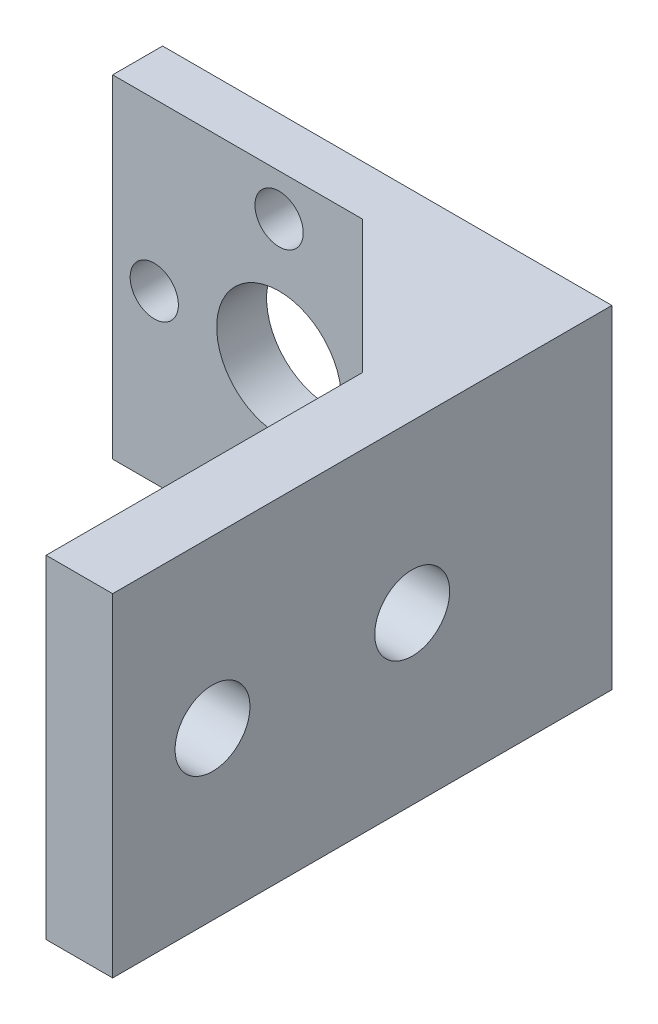
ISO-10303-21;
HEADER;
FILE_DESCRIPTION(('STEP AP214'),'2;1');
FILE_NAME('part.step','',(''),(''),'','','');
FILE_SCHEMA(('AUTOMOTIVE_DESIGN { 1 0 10303 214 1 1 1 1 }'));
ENDSEC;
DATA;
#1=APPLICATION_CONTEXT('core data for automotive mechanical design processes');
#2=APPLICATION_PROTOCOL_DEFINITION('international standard','automotive_design',2000,#1);
#3=PRODUCT_CONTEXT('',#1,'mechanical');
#4=PRODUCT('Part','Part','',(#3));
#5=PRODUCT_RELATED_PRODUCT_CATEGORY('part','',(#4));
#6=PRODUCT_DEFINITION_FORMATION('','',#4);
#7=PRODUCT_DEFINITION_CONTEXT('part definition',#1,'design');
#8=PRODUCT_DEFINITION('design','',#6,#7);
#9=PRODUCT_DEFINITION_SHAPE('','',#8);
#10=(LENGTH_UNIT() NAMED_UNIT(*) SI_UNIT(.MILLI.,.METRE.));
#11=(NAMED_UNIT(*) PLANE_ANGLE_UNIT() SI_UNIT($,.RADIAN.));
#12=(NAMED_UNIT(*) SI_UNIT($,.STERADIAN.) SOLID_ANGLE_UNIT());
#13=UNCERTAINTY_MEASURE_WITH_UNIT(LENGTH_MEASURE(1.E-05),#10,'distance_accuracy_value','');
#14=(GEOMETRIC_REPRESENTATION_CONTEXT(3) GLOBAL_UNCERTAINTY_ASSIGNED_CONTEXT((#13)) GLOBAL_UNIT_ASSIGNED_CONTEXT((#10,
#11,#12)) REPRESENTATION_CONTEXT('',''));
#15=CARTESIAN_POINT('',(0.,0.,0.));
#16=DIRECTION('',(0.,0.,1.));
#17=DIRECTION('',(1.,0.,0.));
#18=AXIS2_PLACEMENT_3D('',#15,#16,#17);
#19=CARTESIAN_POINT('',(17.,10.,30.));
#20=DIRECTION('',(1.,0.,0.));
#21=DIRECTION('',(0.,1.,0.));
#22=AXIS2_PLACEMENT_3D('',#19,#20,#21);
#23=PLANE('',#22);
#24=DIRECTION('',(0.,-1.,0.));
#25=VECTOR('',#24,1.);
#26=CARTESIAN_POINT('',(17.,10.,0.));
#27=LINE('',#26,#25);
#28=CARTESIAN_POINT('',(17.,10.,0.));
#29=VERTEX_POINT('',#28);
#30=CARTESIAN_POINT('',(17.,-10.,0.));
#31=VERTEX_POINT('',#30);
#32=EDGE_CURVE('E261',#29,#31,#27,.T.);
#33=ORIENTED_EDGE('',*,*,#32,.F.);
#34=DIRECTION('',(0.,0.,-1.));
#35=VECTOR('',#34,1.);
#36=CARTESIAN_POINT('',(17.,10.,30.));
#37=LINE('',#36,#35);
#38=CARTESIAN_POINT('',(17.,10.,30.));
#39=VERTEX_POINT('',#38);
#40=EDGE_CURVE('E224',#39,#29,#37,.T.);
#41=ORIENTED_EDGE('',*,*,#40,.F.);
#42=DIRECTION('',(0.,-1.,0.));
#43=VECTOR('',#42,1.);
#44=CARTESIAN_POINT('',(17.,10.,30.));
#45=LINE('',#44,#43);
#46=CARTESIAN_POINT('',(17.,-10.,30.));
#47=VERTEX_POINT('',#46);
#48=EDGE_CURVE('E267',#39,#47,#45,.T.);
#49=ORIENTED_EDGE('',*,*,#48,.T.);
#50=DIRECTION('',(0.,0.,-1.));
#51=VECTOR('',#50,1.);
#52=CARTESIAN_POINT('',(17.,-10.,30.));
#53=LINE('',#52,#51);
#54=EDGE_CURVE('E256',#47,#31,#53,.T.);
#55=ORIENTED_EDGE('',*,*,#54,.T.);
#56=EDGE_LOOP('',(#33,#41,#49,#55));
#57=FACE_BOUND('',#56,.T.);
#58=CARTESIAN_POINT('',(17.,0.,24.));
#59=DIRECTION('',(-1.,0.,0.));
#60=DIRECTION('',(0.,0.,1.));
#61=AXIS2_PLACEMENT_3D('',#58,#59,#60);
#62=CIRCLE('',#61,2.25);
#63=CARTESIAN_POINT('',(17.,0.,26.25));
#64=VERTEX_POINT('',#63);
#65=EDGE_CURVE('E275',#64,#64,#62,.T.);
#66=ORIENTED_EDGE('',*,*,#65,.T.);
#67=EDGE_LOOP('',(#66));
#68=FACE_BOUND('',#67,.T.);
#69=CARTESIAN_POINT('',(17.,0.,12.));
#70=DIRECTION('',(-1.,0.,0.));
#71=DIRECTION('',(0.,0.,1.));
#72=AXIS2_PLACEMENT_3D('',#69,#70,#71);
#73=CIRCLE('',#72,2.25);
#74=CARTESIAN_POINT('',(17.,0.,14.25));
#75=VERTEX_POINT('',#74);
#76=EDGE_CURVE('E117',#75,#75,#73,.T.);
#77=ORIENTED_EDGE('',*,*,#76,.T.);
#78=EDGE_LOOP('',(#77));
#79=FACE_BOUND('',#78,.T.);
#80=ADVANCED_FACE('F32',(#57,#68,#79),#23,.T.);
#81=CARTESIAN_POINT('',(13.,10.,11.0000000000001));
#82=DIRECTION('',(0.707106781186544,0.,-0.707106781186551));
#83=DIRECTION('',(0.,-1.,0.));
#84=AXIS2_PLACEMENT_3D('',#81,#82,#83);
#85=PLANE('',#84);
#86=CARTESIAN_POINT('',(0.,0.,-1.99999999999981));
#87=DIRECTION('',(0.707106781186544,0.,-0.707106781186551));
#88=DIRECTION('',(0.707106781186551,0.,0.707106781186544));
#89=AXIS2_PLACEMENT_3D('',#86,#87,#88);
#90=ELLIPSE('',#89,14.8492424049174,10.5);
#91=CARTESIAN_POINT('',(4.99999999999986,9.23309265630977,3.));
#92=VERTEX_POINT('',#91);
#93=CARTESIAN_POINT('',(10.3660714285714,1.67169469035333,8.36607142857149));
#94=VERTEX_POINT('',#93);
#95=EDGE_CURVE('E127',#92,#94,#90,.T.);
#96=ORIENTED_EDGE('',*,*,#95,.T.);
#97=CARTESIAN_POINT('',(14.,0.,12.));
#98=DIRECTION('',(0.707106781186544,0.,-0.707106781186551));
#99=DIRECTION('',(-0.707106781186551,0.,-0.707106781186544));
#100=AXIS2_PLACEMENT_3D('',#97,#98,#99);
#101=ELLIPSE('',#100,5.6568542494924,4.);
#102=CARTESIAN_POINT('',(13.,3.87298334620743,11.0000000000001));
#103=VERTEX_POINT('',#102);
#104=EDGE_CURVE('E49',#94,#103,#101,.T.);
#105=ORIENTED_EDGE('',*,*,#104,.T.);
#106=DIRECTION('',(0.,-1.,0.));
#107=VECTOR('',#106,1.);
#108=CARTESIAN_POINT('',(13.,10.,11.0000000000001));
#109=LINE('',#108,#107);
#110=CARTESIAN_POINT('',(13.,10.,11.0000000000001));
#111=VERTEX_POINT('',#110);
#112=EDGE_CURVE('E125',#111,#103,#109,.T.);
#113=ORIENTED_EDGE('',*,*,#112,.F.);
#114=DIRECTION('',(0.707106781186551,0.,0.707106781186544));
#115=VECTOR('',#114,1.);
#116=CARTESIAN_POINT('',(-2.50000000000014,10.,-4.49999999999993));
#117=LINE('',#116,#115);
#118=CARTESIAN_POINT('',(4.99999999999986,10.,3.));
#119=VERTEX_POINT('',#118);
#120=EDGE_CURVE('E148',#119,#111,#117,.T.);
#121=ORIENTED_EDGE('',*,*,#120,.F.);
#122=DIRECTION('',(0.,1.,0.));
#123=VECTOR('',#122,1.);
#124=CARTESIAN_POINT('',(4.99999999999986,0.,3.));
#125=LINE('',#124,#123);
#126=EDGE_CURVE('E135',#92,#119,#125,.T.);
#127=ORIENTED_EDGE('',*,*,#126,.F.);
#128=EDGE_LOOP('',(#96,#105,#113,#121,#127));
#129=FACE_BOUND('',#128,.T.);
#130=ADVANCED_FACE('F123',(#129),#85,.F.);
#131=CARTESIAN_POINT('',(-9.99999999999999,10.,3.));
#132=DIRECTION('',(0.,-1.,0.));
#133=DIRECTION('',(0.,0.,-1.));
#134=AXIS2_PLACEMENT_3D('',#131,#132,#133);
#135=PLANE('',#134);
#136=DIRECTION('',(-1.,0.,0.));
#137=VECTOR('',#136,1.);
#138=CARTESIAN_POINT('',(-9.99999999999999,10.,0.));
#139=LINE('',#138,#137);
#140=CARTESIAN_POINT('',(-9.99999999999999,10.,0.));
#141=VERTEX_POINT('',#140);
#142=EDGE_CURVE('E219',#29,#141,#139,.T.);
#143=ORIENTED_EDGE('',*,*,#142,.T.);
#144=DIRECTION('',(0.,0.,-1.));
#145=VECTOR('',#144,1.);
#146=CARTESIAN_POINT('',(-9.99999999999999,10.,3.));
#147=LINE('',#146,#145);
#148=CARTESIAN_POINT('',(-9.99999999999999,10.,3.));
#149=VERTEX_POINT('',#148);
#150=EDGE_CURVE('E140',#149,#141,#147,.T.);
#151=ORIENTED_EDGE('',*,*,#150,.F.);
#152=DIRECTION('',(-1.,0.,0.));
#153=VECTOR('',#152,1.);
#154=CARTESIAN_POINT('',(-9.99999999999999,10.,3.));
#155=LINE('',#154,#153);
#156=EDGE_CURVE('E238',#119,#149,#155,.T.);
#157=ORIENTED_EDGE('',*,*,#156,.F.);
#158=ORIENTED_EDGE('',*,*,#120,.T.);
#159=DIRECTION('',(0.,0.,-1.));
#160=VECTOR('',#159,1.);
#161=CARTESIAN_POINT('',(13.,10.,30.));
#162=LINE('',#161,#160);
#163=CARTESIAN_POINT('',(13.,10.,30.));
#164=VERTEX_POINT('',#163);
#165=EDGE_CURVE('E134',#164,#111,#162,.T.);
#166=ORIENTED_EDGE('',*,*,#165,.F.);
#167=DIRECTION('',(1.,0.,0.));
#168=VECTOR('',#167,1.);
#169=CARTESIAN_POINT('',(13.,10.,30.));
#170=LINE('',#169,#168);
#171=EDGE_CURVE('E270',#164,#39,#170,.T.);
#172=ORIENTED_EDGE('',*,*,#171,.T.);
#173=ORIENTED_EDGE('',*,*,#40,.T.);
#174=EDGE_LOOP('',(#143,#151,#157,#158,#166,#172,#173));
#175=FACE_BOUND('',#174,.T.);
#176=ADVANCED_FACE('F186',(#175),#135,.F.);
#177=CARTESIAN_POINT('',(-9.99999999999999,-10.,3.));
#178=DIRECTION('',(1.,0.,0.));
#179=DIRECTION('',(0.,0.,-1.));
#180=AXIS2_PLACEMENT_3D('',#177,#178,#179);
#181=PLANE('',#180);
#182=DIRECTION('',(0.,-1.,0.));
#183=VECTOR('',#182,1.);
#184=CARTESIAN_POINT('',(-9.99999999999999,-10.,0.));
#185=LINE('',#184,#183);
#186=CARTESIAN_POINT('',(-9.99999999999999,-10.,0.));
#187=VERTEX_POINT('',#186);
#188=EDGE_CURVE('E228',#141,#187,#185,.T.);
#189=ORIENTED_EDGE('',*,*,#188,.T.);
#190=DIRECTION('',(0.,0.,-1.));
#191=VECTOR('',#190,1.);
#192=CARTESIAN_POINT('',(-9.99999999999999,-10.,3.));
#193=LINE('',#192,#191);
#194=CARTESIAN_POINT('',(-9.99999999999999,-10.,3.));
#195=VERTEX_POINT('',#194);
#196=EDGE_CURVE('E234',#195,#187,#193,.T.);
#197=ORIENTED_EDGE('',*,*,#196,.F.);
#198=DIRECTION('',(0.,-1.,0.));
#199=VECTOR('',#198,1.);
#200=CARTESIAN_POINT('',(-9.99999999999999,-10.,3.));
#201=LINE('',#200,#199);
#202=EDGE_CURVE('E233',#149,#195,#201,.T.);
#203=ORIENTED_EDGE('',*,*,#202,.F.);
#204=ORIENTED_EDGE('',*,*,#150,.T.);
#205=EDGE_LOOP('',(#189,#197,#203,#204));
#206=FACE_BOUND('',#205,.T.);
#207=ADVANCED_FACE('F209',(#206),#181,.F.);
#208=CARTESIAN_POINT('',(-9.99999999999999,-10.,3.));
#209=DIRECTION('',(0.,1.,0.));
#210=DIRECTION('',(0.,0.,1.));
#211=AXIS2_PLACEMENT_3D('',#208,#209,#210);
#212=PLANE('',#211);
#213=DIRECTION('',(1.,0.,0.));
#214=VECTOR('',#213,1.);
#215=CARTESIAN_POINT('',(-9.99999999999999,-10.,0.));
#216=LINE('',#215,#214);
#217=EDGE_CURVE('E236',#187,#31,#216,.T.);
#218=ORIENTED_EDGE('',*,*,#217,.T.);
#219=ORIENTED_EDGE('',*,*,#54,.F.);
#220=DIRECTION('',(-1.,0.,0.));
#221=VECTOR('',#220,1.);
#222=CARTESIAN_POINT('',(13.,-10.,30.));
#223=LINE('',#222,#221);
#224=CARTESIAN_POINT('',(13.,-10.,30.));
#225=VERTEX_POINT('',#224);
#226=EDGE_CURVE('E254',#47,#225,#223,.T.);
#227=ORIENTED_EDGE('',*,*,#226,.T.);
#228=DIRECTION('',(0.,0.,-1.));
#229=VECTOR('',#228,1.);
#230=CARTESIAN_POINT('',(13.,-10.,30.));
#231=LINE('',#230,#229);
#232=CARTESIAN_POINT('',(13.,-10.,11.0000000000001));
#233=VERTEX_POINT('',#232);
#234=EDGE_CURVE('E250',#225,#233,#231,.T.);
#235=ORIENTED_EDGE('',*,*,#234,.T.);
#236=DIRECTION('',(-0.707106781186551,0.,-0.707106781186544));
#237=VECTOR('',#236,1.);
#238=CARTESIAN_POINT('',(-2.50000000000014,-10.,-4.49999999999993));
#239=LINE('',#238,#237);
#240=CARTESIAN_POINT('',(4.99999999999986,-10.,3.));
#241=VERTEX_POINT('',#240);
#242=EDGE_CURVE('E145',#233,#241,#239,.T.);
#243=ORIENTED_EDGE('',*,*,#242,.T.);
#244=DIRECTION('',(1.,0.,0.));
#245=VECTOR('',#244,1.);
#246=CARTESIAN_POINT('',(-9.99999999999999,-10.,3.));
#247=LINE('',#246,#245);
#248=EDGE_CURVE('E241',#195,#241,#247,.T.);
#249=ORIENTED_EDGE('',*,*,#248,.F.);
#250=ORIENTED_EDGE('',*,*,#196,.T.);
#251=EDGE_LOOP('',(#218,#219,#227,#235,#243,#249,#250));
#252=FACE_BOUND('',#251,.T.);
#253=ADVANCED_FACE('F202',(#252),#212,.F.);
#254=CARTESIAN_POINT('',(0.,0.,3.));
#255=DIRECTION('',(0.,0.,-1.));
#256=DIRECTION('',(-1.,0.,0.));
#257=AXIS2_PLACEMENT_3D('',#254,#255,#256);
#258=PLANE('',#257);
#259=CARTESIAN_POINT('',(0.,7.5,3.));
#260=DIRECTION('',(0.,0.,-1.));
#261=DIRECTION('',(-1.,0.,0.));
#262=AXIS2_PLACEMENT_3D('',#259,#260,#261);
#263=CIRCLE('',#262,1.45);
#264=CARTESIAN_POINT('',(-1.45,7.5,3.));
#265=VERTEX_POINT('',#264);
#266=EDGE_CURVE('E36',#265,#265,#263,.T.);
#267=ORIENTED_EDGE('',*,*,#266,.T.);
#268=EDGE_LOOP('',(#267));
#269=FACE_BOUND('',#268,.T.);
#270=CARTESIAN_POINT('',(7.5,0.,3.));
#271=DIRECTION('',(0.,0.,-1.));
#272=DIRECTION('',(-1.,0.,0.));
#273=AXIS2_PLACEMENT_3D('',#270,#271,#272);
#274=CIRCLE('',#273,1.45);
#275=CARTESIAN_POINT('',(6.05,0.,3.));
#276=VERTEX_POINT('',#275);
#277=EDGE_CURVE('E291',#276,#276,#274,.T.);
#278=ORIENTED_EDGE('',*,*,#277,.T.);
#279=EDGE_LOOP('',(#278));
#280=FACE_BOUND('',#279,.T.);
#281=CARTESIAN_POINT('',(-7.5,0.,3.));
#282=DIRECTION('',(0.,0.,-1.));
#283=DIRECTION('',(-1.,0.,0.));
#284=AXIS2_PLACEMENT_3D('',#281,#282,#283);
#285=CIRCLE('',#284,1.45);
#286=CARTESIAN_POINT('',(-8.95,0.,3.));
#287=VERTEX_POINT('',#286);
#288=EDGE_CURVE('E285',#287,#287,#285,.T.);
#289=ORIENTED_EDGE('',*,*,#288,.T.);
#290=EDGE_LOOP('',(#289));
#291=FACE_BOUND('',#290,.T.);
#292=CARTESIAN_POINT('',(0.,-7.5,3.));
#293=DIRECTION('',(0.,0.,-1.));
#294=DIRECTION('',(-1.,0.,0.));
#295=AXIS2_PLACEMENT_3D('',#292,#293,#294);
#296=CIRCLE('',#295,1.45);
#297=CARTESIAN_POINT('',(-1.45,-7.5,3.));
#298=VERTEX_POINT('',#297);
#299=EDGE_CURVE('E118',#298,#298,#296,.T.);
#300=ORIENTED_EDGE('',*,*,#299,.T.);
#301=EDGE_LOOP('',(#300));
#302=FACE_BOUND('',#301,.T.);
#303=ORIENTED_EDGE('',*,*,#248,.T.);
#304=CARTESIAN_POINT('',(4.99999999999986,-9.23309265630976,3.));
#305=VERTEX_POINT('',#304);
#306=EDGE_CURVE('E138',#241,#305,#125,.T.);
#307=ORIENTED_EDGE('',*,*,#306,.T.);
#308=CARTESIAN_POINT('',(0.,0.,3.));
#309=DIRECTION('',(0.,0.,-1.));
#310=DIRECTION('',(-1.,0.,0.));
#311=AXIS2_PLACEMENT_3D('',#308,#309,#310);
#312=CIRCLE('',#311,10.5);
#313=EDGE_CURVE('E264',#305,#92,#312,.F.);
#314=ORIENTED_EDGE('',*,*,#313,.T.);
#315=ORIENTED_EDGE('',*,*,#126,.T.);
#316=ORIENTED_EDGE('',*,*,#156,.T.);
#317=ORIENTED_EDGE('',*,*,#202,.T.);
#318=EDGE_LOOP('',(#303,#307,#314,#315,#316,#317));
#319=FACE_BOUND('',#318,.T.);
#320=CARTESIAN_POINT('',(0.,0.,3.));
#321=DIRECTION('',(0.,0.,1.));
#322=DIRECTION('',(1.,0.,0.));
#323=AXIS2_PLACEMENT_3D('',#320,#321,#322);
#324=CIRCLE('',#323,3.75);
#325=CARTESIAN_POINT('',(3.75,0.,3.));
#326=VERTEX_POINT('',#325);
#327=EDGE_CURVE('E247',#326,#326,#324,.T.);
#328=ORIENTED_EDGE('',*,*,#327,.F.);
#329=EDGE_LOOP('',(#328));
#330=FACE_BOUND('',#329,.T.);
#331=ADVANCED_FACE('F199',(#269,#280,#291,#302,#319,#330),#258,.F.);
#332=CARTESIAN_POINT('',(0.,0.,0.));
#333=DIRECTION('',(0.,0.,-1.));
#334=DIRECTION('',(-1.,0.,0.));
#335=AXIS2_PLACEMENT_3D('',#332,#333,#334);
#336=PLANE('',#335);
#337=CARTESIAN_POINT('',(0.,7.5,0.));
#338=DIRECTION('',(0.,0.,-1.));
#339=DIRECTION('',(-1.,0.,0.));
#340=AXIS2_PLACEMENT_3D('',#337,#338,#339);
#341=CIRCLE('',#340,1.45);
#342=CARTESIAN_POINT('',(-1.45,7.5,0.));
#343=VERTEX_POINT('',#342);
#344=EDGE_CURVE('E295',#343,#343,#341,.T.);
#345=ORIENTED_EDGE('',*,*,#344,.F.);
#346=EDGE_LOOP('',(#345));
#347=FACE_BOUND('',#346,.T.);
#348=CARTESIAN_POINT('',(7.5,0.,0.));
#349=DIRECTION('',(0.,0.,-1.));
#350=DIRECTION('',(-1.,0.,0.));
#351=AXIS2_PLACEMENT_3D('',#348,#349,#350);
#352=CIRCLE('',#351,1.45);
#353=CARTESIAN_POINT('',(6.05,0.,0.));
#354=VERTEX_POINT('',#353);
#355=EDGE_CURVE('E292',#354,#354,#352,.T.);
#356=ORIENTED_EDGE('',*,*,#355,.F.);
#357=EDGE_LOOP('',(#356));
#358=FACE_BOUND('',#357,.T.);
#359=CARTESIAN_POINT('',(-7.5,0.,0.));
#360=DIRECTION('',(0.,0.,-1.));
#361=DIRECTION('',(-1.,0.,0.));
#362=AXIS2_PLACEMENT_3D('',#359,#360,#361);
#363=CIRCLE('',#362,1.45);
#364=CARTESIAN_POINT('',(-8.95,0.,0.));
#365=VERTEX_POINT('',#364);
#366=EDGE_CURVE('E288',#365,#365,#363,.T.);
#367=ORIENTED_EDGE('',*,*,#366,.F.);
#368=EDGE_LOOP('',(#367));
#369=FACE_BOUND('',#368,.T.);
#370=CARTESIAN_POINT('',(0.,-7.5,0.));
#371=DIRECTION('',(0.,0.,-1.));
#372=DIRECTION('',(-1.,0.,0.));
#373=AXIS2_PLACEMENT_3D('',#370,#371,#372);
#374=CIRCLE('',#373,1.45);
#375=CARTESIAN_POINT('',(-1.45,-7.5,0.));
#376=VERTEX_POINT('',#375);
#377=EDGE_CURVE('E282',#376,#376,#374,.T.);
#378=ORIENTED_EDGE('',*,*,#377,.F.);
#379=EDGE_LOOP('',(#378));
#380=FACE_BOUND('',#379,.T.);
#381=CARTESIAN_POINT('',(0.,0.,0.));
#382=DIRECTION('',(0.,0.,1.));
#383=DIRECTION('',(1.,0.,0.));
#384=AXIS2_PLACEMENT_3D('',#381,#382,#383);
#385=CIRCLE('',#384,3.75);
#386=CARTESIAN_POINT('',(3.75,0.,0.));
#387=VERTEX_POINT('',#386);
#388=EDGE_CURVE('E229',#387,#387,#385,.T.);
#389=ORIENTED_EDGE('',*,*,#388,.T.);
#390=EDGE_LOOP('',(#389));
#391=FACE_BOUND('',#390,.T.);
#392=ORIENTED_EDGE('',*,*,#142,.F.);
#393=ORIENTED_EDGE('',*,*,#32,.T.);
#394=ORIENTED_EDGE('',*,*,#217,.F.);
#395=ORIENTED_EDGE('',*,*,#188,.F.);
#396=EDGE_LOOP('',(#392,#393,#394,#395));
#397=FACE_BOUND('',#396,.T.);
#398=ADVANCED_FACE('F197',(#347,#358,#369,#380,#391,#397),#336,.T.);
#399=CARTESIAN_POINT('',(0.,0.,0.));
#400=DIRECTION('',(0.,0.,1.));
#401=DIRECTION('',(1.,0.,0.));
#402=AXIS2_PLACEMENT_3D('',#399,#400,#401);
#403=CYLINDRICAL_SURFACE('',#402,3.75);
#404=ORIENTED_EDGE('',*,*,#388,.F.);
#405=EDGE_LOOP('',(#404));
#406=FACE_BOUND('',#405,.T.);
#407=ORIENTED_EDGE('',*,*,#327,.T.);
#408=EDGE_LOOP('',(#407));
#409=FACE_BOUND('',#408,.T.);
#410=ADVANCED_FACE('F193',(#406,#409),#403,.F.);
#411=CARTESIAN_POINT('',(13.,10.,30.));
#412=DIRECTION('',(-1.,0.,0.));
#413=DIRECTION('',(0.,0.,1.));
#414=AXIS2_PLACEMENT_3D('',#411,#412,#413);
#415=PLANE('',#414);
#416=CARTESIAN_POINT('',(13.,0.,12.));
#417=DIRECTION('',(-1.,0.,0.));
#418=DIRECTION('',(0.,0.,1.));
#419=AXIS2_PLACEMENT_3D('',#416,#417,#418);
#420=CIRCLE('',#419,2.25);
#421=CARTESIAN_POINT('',(13.,0.,14.25));
#422=VERTEX_POINT('',#421);
#423=EDGE_CURVE('E11',#422,#422,#420,.T.);
#424=ORIENTED_EDGE('',*,*,#423,.F.);
#425=EDGE_LOOP('',(#424));
#426=FACE_BOUND('',#425,.T.);
#427=ORIENTED_EDGE('',*,*,#112,.T.);
#428=CARTESIAN_POINT('',(13.,0.,12.));
#429=DIRECTION('',(-1.,0.,0.));
#430=DIRECTION('',(0.,0.,1.));
#431=AXIS2_PLACEMENT_3D('',#428,#429,#430);
#432=CIRCLE('',#431,3.99999999999999);
#433=CARTESIAN_POINT('',(13.,-3.87298334620743,11.0000000000001));
#434=VERTEX_POINT('',#433);
#435=EDGE_CURVE('E111',#103,#434,#432,.T.);
#436=ORIENTED_EDGE('',*,*,#435,.T.);
#437=EDGE_CURVE('E136',#434,#233,#109,.T.);
#438=ORIENTED_EDGE('',*,*,#437,.T.);
#439=ORIENTED_EDGE('',*,*,#234,.F.);
#440=DIRECTION('',(0.,1.,0.));
#441=VECTOR('',#440,1.);
#442=CARTESIAN_POINT('',(13.,10.,30.));
#443=LINE('',#442,#441);
#444=EDGE_CURVE('E263',#225,#164,#443,.T.);
#445=ORIENTED_EDGE('',*,*,#444,.T.);
#446=ORIENTED_EDGE('',*,*,#165,.T.);
#447=EDGE_LOOP('',(#427,#436,#438,#439,#445,#446));
#448=FACE_BOUND('',#447,.T.);
#449=CARTESIAN_POINT('',(13.,0.,24.));
#450=DIRECTION('',(-1.,0.,0.));
#451=DIRECTION('',(0.,0.,1.));
#452=AXIS2_PLACEMENT_3D('',#449,#450,#451);
#453=CIRCLE('',#452,2.25);
#454=CARTESIAN_POINT('',(13.,0.,26.25));
#455=VERTEX_POINT('',#454);
#456=EDGE_CURVE('E128',#455,#455,#453,.T.);
#457=ORIENTED_EDGE('',*,*,#456,.F.);
#458=EDGE_LOOP('',(#457));
#459=FACE_BOUND('',#458,.T.);
#460=ADVANCED_FACE('F131',(#426,#448,#459),#415,.T.);
#461=CARTESIAN_POINT('',(0.,0.,30.));
#462=DIRECTION('',(0.,0.,1.));
#463=DIRECTION('',(1.,0.,0.));
#464=AXIS2_PLACEMENT_3D('',#461,#462,#463);
#465=PLANE('',#464);
#466=ORIENTED_EDGE('',*,*,#444,.F.);
#467=ORIENTED_EDGE('',*,*,#226,.F.);
#468=ORIENTED_EDGE('',*,*,#48,.F.);
#469=ORIENTED_EDGE('',*,*,#171,.F.);
#470=EDGE_LOOP('',(#466,#467,#468,#469));
#471=FACE_BOUND('',#470,.T.);
#472=ADVANCED_FACE('F190',(#471),#465,.T.);
#473=ORIENTED_EDGE('',*,*,#437,.F.);
#474=CARTESIAN_POINT('',(10.3660714285714,-1.67169469035333,8.36607142857149));
#475=VERTEX_POINT('',#474);
#476=EDGE_CURVE('E113',#434,#475,#101,.T.);
#477=ORIENTED_EDGE('',*,*,#476,.T.);
#478=EDGE_CURVE('E57',#475,#305,#90,.T.);
#479=ORIENTED_EDGE('',*,*,#478,.T.);
#480=ORIENTED_EDGE('',*,*,#306,.F.);
#481=ORIENTED_EDGE('',*,*,#242,.F.);
#482=EDGE_LOOP('',(#473,#477,#479,#480,#481));
#483=FACE_BOUND('',#482,.T.);
#484=ADVANCED_FACE('F34',(#483),#85,.F.);
#485=CARTESIAN_POINT('',(0.,0.,-26.698484809835));
#486=DIRECTION('',(0.,0.,1.));
#487=DIRECTION('',(1.,0.,0.));
#488=AXIS2_PLACEMENT_3D('',#485,#486,#487);
#489=CYLINDRICAL_SURFACE('',#488,10.5);
#490=ORIENTED_EDGE('',*,*,#478,.F.);
#491=CARTESIAN_POINT('',(10.3087384776218,-1.99497142836693,8.53300000000006));
#492=CARTESIAN_POINT('',(10.3266386895717,-1.90252611194088,8.47979446743172));
#493=CARTESIAN_POINT('',(10.3436692539268,-1.8078071992182,8.43022450878776));
#494=CARTESIAN_POINT('',(10.3756107637318,-1.61439027119568,8.33869227604306));
#495=CARTESIAN_POINT('',(10.3905211695665,-1.51569125106859,8.29673193797009));
#496=CARTESIAN_POINT('',(10.4178358125061,-1.31490580843044,8.22077380614533));
#497=CARTESIAN_POINT('',(10.4302394504165,-1.21281858280757,8.18677791583202));
#498=CARTESIAN_POINT('',(10.4522175739881,-1.00596230435648,8.12706495753762));
#499=CARTESIAN_POINT('',(10.4617923539233,-0.901193531711265,8.1013470284102));
#500=CARTESIAN_POINT('',(10.4778758274298,-0.68949703796321,8.05839127014676));
#501=CARTESIAN_POINT('',(10.484378911232,-0.582565735885015,8.04116895383266));
#502=CARTESIAN_POINT('',(10.4941203117854,-0.367471291212491,8.01544199300899));
#503=CARTESIAN_POINT('',(10.4973574029267,-0.259307701571549,8.00694062113714));
#504=CARTESIAN_POINT('',(10.5004710251385,-0.0426878826617025,7.99876149309374));
#505=CARTESIAN_POINT('',(10.5003505184892,0.0657680042429616,7.99907595904705));
#506=CARTESIAN_POINT('',(10.4967655056341,0.282253102280678,8.00849754322463));
#507=CARTESIAN_POINT('',(10.4932998716216,0.390282157173362,8.01760762688384));
#508=CARTESIAN_POINT('',(10.4782723332989,0.706673358702136,8.05730108481142));
#509=CARTESIAN_POINT('',(10.4621550237266,0.913422720287297,8.1000393359921));
#510=CARTESIAN_POINT('',(10.4191262875563,1.31639581853764,8.21699839167447));
#511=CARTESIAN_POINT('',(10.3922251173647,1.5126293562065,8.29118928577559));
#512=CARTESIAN_POINT('',(10.353050715611,1.75127073722836,8.40331627258954));
#513=CARTESIAN_POINT('',(10.3445342763887,1.80086176947632,8.42789104420619));
#514=CARTESIAN_POINT('',(10.327000802825,1.89881896343581,8.47898816760394));
#515=CARTESIAN_POINT('',(10.3179847345341,1.94718724254605,8.5055067908748));
#516=CARTESIAN_POINT('',(10.3087384776218,1.99497142836694,8.53300000000006));
#517=B_SPLINE_CURVE_WITH_KNOTS('',3,(#491,#492,#493,#494,#495,#496,#497,#498,#499,#500,#501,
#502,#503,#504,#505,#506,#507,#508,#509,#510,#511,#512,#513,#514,#515,#516),.UNSPECIFIED.,.F.,
.F.,(4,2,2,2,2,2,2,2,2,2,2,2,4),(0.,0.324392314727214,0.648867045410189,0.973419243996775,
1.29793766888818,1.62304648460255,1.948277256671,2.27322109915741,2.59827453445191,
3.23036225820325,3.86185023148795,4.02981250924115,4.1974606481379),.UNSPECIFIED.);
#518=EDGE_CURVE('E41',#475,#94,#517,.T.);
#519=ORIENTED_EDGE('',*,*,#518,.T.);
#520=ORIENTED_EDGE('',*,*,#95,.F.);
#521=ORIENTED_EDGE('',*,*,#313,.F.);
#522=EDGE_LOOP('',(#490,#519,#520,#521));
#523=FACE_BOUND('',#522,.T.);
#524=ADVANCED_FACE('F158',(#523),#489,.F.);
#525=CARTESIAN_POINT('',(-9.99999999999999,0.,24.));
#526=DIRECTION('',(-1.,0.,0.));
#527=DIRECTION('',(0.,0.,1.));
#528=AXIS2_PLACEMENT_3D('',#525,#526,#527);
#529=CYLINDRICAL_SURFACE('',#528,2.25);
#530=ORIENTED_EDGE('',*,*,#65,.F.);
#531=EDGE_LOOP('',(#530));
#532=FACE_BOUND('',#531,.T.);
#533=ORIENTED_EDGE('',*,*,#456,.T.);
#534=EDGE_LOOP('',(#533));
#535=FACE_BOUND('',#534,.T.);
#536=ADVANCED_FACE('F167',(#532,#535),#529,.F.);
#537=CARTESIAN_POINT('',(-9.99999999999999,0.,12.));
#538=DIRECTION('',(-1.,0.,0.));
#539=DIRECTION('',(0.,0.,1.));
#540=AXIS2_PLACEMENT_3D('',#537,#538,#539);
#541=CYLINDRICAL_SURFACE('',#540,4.);
#542=ORIENTED_EDGE('',*,*,#518,.F.);
#543=ORIENTED_EDGE('',*,*,#476,.F.);
#544=ORIENTED_EDGE('',*,*,#435,.F.);
#545=ORIENTED_EDGE('',*,*,#104,.F.);
#546=EDGE_LOOP('',(#542,#543,#544,#545));
#547=FACE_BOUND('',#546,.T.);
#548=ADVANCED_FACE('F112',(#547),#541,.F.);
#549=CARTESIAN_POINT('',(-9.99999999999999,0.,12.));
#550=DIRECTION('',(-1.,0.,0.));
#551=DIRECTION('',(0.,0.,1.));
#552=AXIS2_PLACEMENT_3D('',#549,#550,#551);
#553=CYLINDRICAL_SURFACE('',#552,2.25);
#554=ORIENTED_EDGE('',*,*,#76,.F.);
#555=EDGE_LOOP('',(#554));
#556=FACE_BOUND('',#555,.T.);
#557=ORIENTED_EDGE('',*,*,#423,.T.);
#558=EDGE_LOOP('',(#557));
#559=FACE_BOUND('',#558,.T.);
#560=ADVANCED_FACE('F166',(#556,#559),#553,.F.);
#561=CARTESIAN_POINT('',(0.,-7.5,0.));
#562=DIRECTION('',(0.,0.,-1.));
#563=DIRECTION('',(-1.,0.,0.));
#564=AXIS2_PLACEMENT_3D('',#561,#562,#563);
#565=CYLINDRICAL_SURFACE('',#564,1.45);
#566=ORIENTED_EDGE('',*,*,#377,.T.);
#567=EDGE_LOOP('',(#566));
#568=FACE_BOUND('',#567,.T.);
#569=ORIENTED_EDGE('',*,*,#299,.F.);
#570=EDGE_LOOP('',(#569));
#571=FACE_BOUND('',#570,.T.);
#572=ADVANCED_FACE('F168',(#568,#571),#565,.F.);
#573=CARTESIAN_POINT('',(-7.5,0.,0.));
#574=DIRECTION('',(0.,0.,-1.));
#575=DIRECTION('',(-1.,0.,0.));
#576=AXIS2_PLACEMENT_3D('',#573,#574,#575);
#577=CYLINDRICAL_SURFACE('',#576,1.45);
#578=ORIENTED_EDGE('',*,*,#366,.T.);
#579=EDGE_LOOP('',(#578));
#580=FACE_BOUND('',#579,.T.);
#581=ORIENTED_EDGE('',*,*,#288,.F.);
#582=EDGE_LOOP('',(#581));
#583=FACE_BOUND('',#582,.T.);
#584=ADVANCED_FACE('F310',(#580,#583),#577,.F.);
#585=CARTESIAN_POINT('',(7.5,0.,0.));
#586=DIRECTION('',(0.,0.,-1.));
#587=DIRECTION('',(-1.,0.,0.));
#588=AXIS2_PLACEMENT_3D('',#585,#586,#587);
#589=CYLINDRICAL_SURFACE('',#588,1.45);
#590=ORIENTED_EDGE('',*,*,#355,.T.);
#591=EDGE_LOOP('',(#590));
#592=FACE_BOUND('',#591,.T.);
#593=ORIENTED_EDGE('',*,*,#277,.F.);
#594=EDGE_LOOP('',(#593));
#595=FACE_BOUND('',#594,.T.);
#596=ADVANCED_FACE('F305',(#592,#595),#589,.F.);
#597=CARTESIAN_POINT('',(0.,7.5,0.));
#598=DIRECTION('',(0.,0.,-1.));
#599=DIRECTION('',(-1.,0.,0.));
#600=AXIS2_PLACEMENT_3D('',#597,#598,#599);
#601=CYLINDRICAL_SURFACE('',#600,1.45);
#602=ORIENTED_EDGE('',*,*,#344,.T.);
#603=EDGE_LOOP('',(#602));
#604=FACE_BOUND('',#603,.T.);
#605=ORIENTED_EDGE('',*,*,#266,.F.);
#606=EDGE_LOOP('',(#605));
#607=FACE_BOUND('',#606,.T.);
#608=ADVANCED_FACE('F303',(#604,#607),#601,.F.);
#609=CLOSED_SHELL('',(#80,#130,#176,#207,#253,#331,#398,#410,#460,#472,#484,#524,#536,#548,#560,
#572,#584,#596,#608));
#610=MANIFOLD_SOLID_BREP('B2',#609);
#611=ADVANCED_BREP_SHAPE_REPRESENTATION('',(#18,#610),#14);
#612=SHAPE_DEFINITION_REPRESENTATION(#9,#611);
ENDSEC;
END-ISO-10303-21;
